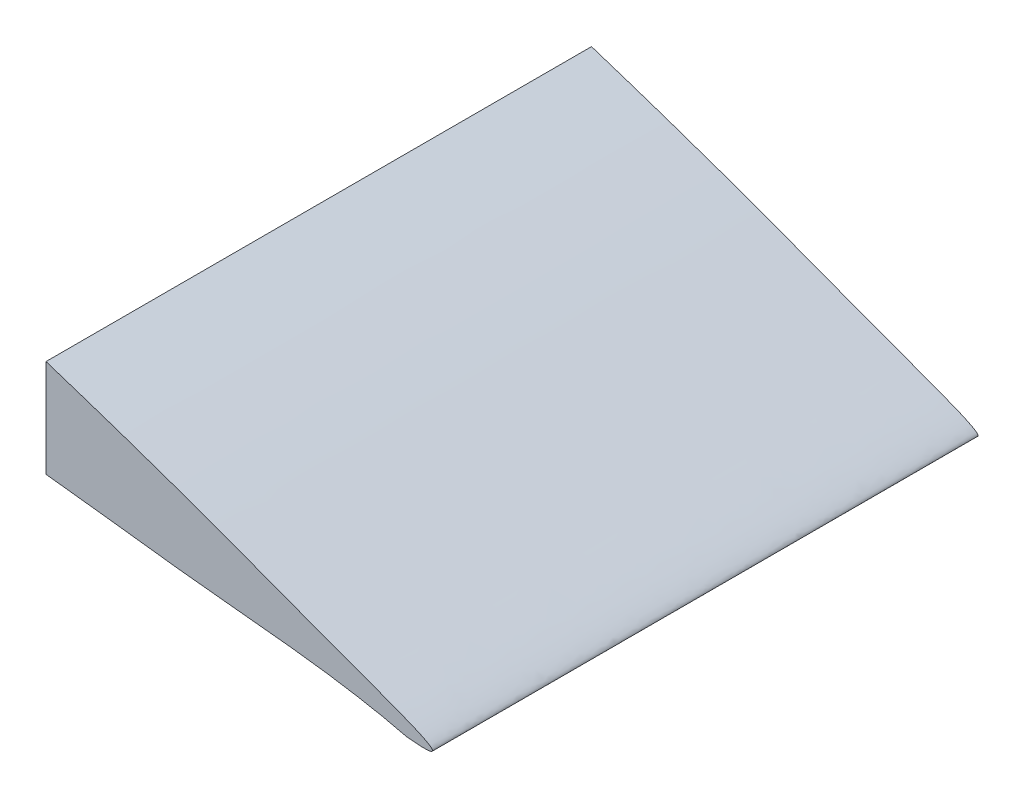
ISO-10303-21;
HEADER;
FILE_DESCRIPTION(('STEP AP214'),'2;1');
FILE_NAME('part.step','',(''),(''),'','','');
FILE_SCHEMA(('AUTOMOTIVE_DESIGN { 1 0 10303 214 1 1 1 1 }'));
ENDSEC;
DATA;
#1=APPLICATION_CONTEXT('core data for automotive mechanical design processes');
#2=APPLICATION_PROTOCOL_DEFINITION('international standard','automotive_design',2000,#1);
#3=PRODUCT_CONTEXT('',#1,'mechanical');
#4=PRODUCT('Part','Part','',(#3));
#5=PRODUCT_RELATED_PRODUCT_CATEGORY('part','',(#4));
#6=PRODUCT_DEFINITION_FORMATION('','',#4);
#7=PRODUCT_DEFINITION_CONTEXT('part definition',#1,'design');
#8=PRODUCT_DEFINITION('design','',#6,#7);
#9=PRODUCT_DEFINITION_SHAPE('','',#8);
#10=(LENGTH_UNIT() NAMED_UNIT(*) SI_UNIT(.MILLI.,.METRE.));
#11=(NAMED_UNIT(*) PLANE_ANGLE_UNIT() SI_UNIT($,.RADIAN.));
#12=(NAMED_UNIT(*) SI_UNIT($,.STERADIAN.) SOLID_ANGLE_UNIT());
#13=UNCERTAINTY_MEASURE_WITH_UNIT(LENGTH_MEASURE(1.E-05),#10,'distance_accuracy_value','');
#14=(GEOMETRIC_REPRESENTATION_CONTEXT(3) GLOBAL_UNCERTAINTY_ASSIGNED_CONTEXT((#13)) GLOBAL_UNIT_ASSIGNED_CONTEXT((#10,
#11,#12)) REPRESENTATION_CONTEXT('',''));
#15=CARTESIAN_POINT('',(0.,0.,0.));
#16=DIRECTION('',(0.,0.,1.));
#17=DIRECTION('',(1.,0.,0.));
#18=AXIS2_PLACEMENT_3D('',#15,#16,#17);
#19=CARTESIAN_POINT('',(0.000560351162113587,0.000130087070423624,46.0375));
#20=CARTESIAN_POINT('',(1.23071418869678,-6.92407609127206,46.0375));
#21=CARTESIAN_POINT('',(15.3166033306834,-6.18906584099094,46.0375));
#22=CARTESIAN_POINT('',(36.4546728163185,-6.09849990105009,46.0375));
#23=CARTESIAN_POINT('',(66.5061971849192,-0.586669106973501,46.0375));
#24=CARTESIAN_POINT('',(110.497331171581,6.18149522271792,46.0375));
#25=CARTESIAN_POINT('',(157.718638091679,9.03065014873911,46.0375));
#26=CARTESIAN_POINT('',(205.10142463584,8.83808028186313,46.0375));
#27=CARTESIAN_POINT('',(235.858814759408,7.87030619247826,46.0375));
#28=CARTESIAN_POINT('',(260.846344817159,5.42741339404395,46.0375));
#29=CARTESIAN_POINT('',(276.264022989737,4.51435670375389,46.0375));
#30=CARTESIAN_POINT('',(293.989507544058,2.09398731346533,46.0375));
#31=CARTESIAN_POINT('',(303.956832564589,1.47095520994628,46.0375));
#32=CARTESIAN_POINT('',(309.846313894505,0.000130087070423666,46.0375));
#33=B_SPLINE_CURVE_WITH_KNOTS('',3,(#19,#20,#21,#22,#23,#24,#25,#26,#27,#28,#29,#30,#31,#32),
.UNSPECIFIED.,.F.,.F.,(4,1,1,1,1,1,1,1,1,1,1,4),(0.,0.0569078595717698,0.106482711504673,
0.214488052979465,0.341297688349143,0.535095665520157,0.664680853556909,0.794660698192775,
0.828978881532905,0.904725108725214,0.942212919019968,1.),.UNSPECIFIED.);
#34=DIRECTION('',(0.,0.,-1.));
#35=VECTOR('',#34,1.);
#36=SURFACE_OF_LINEAR_EXTRUSION('',#33,#35);
#37=CARTESIAN_POINT('',(279.400560351162,3.963287461144,46.0375));
#38=VERTEX_POINT('',#37);
#39=CARTESIAN_POINT('',(309.846313894505,0.000130087070423864,46.0375));
#40=VERTEX_POINT('',#39);
#41=EDGE_CURVE('E66',#38,#40,#33,.T.);
#42=ORIENTED_EDGE('',*,*,#41,.F.);
#43=DIRECTION('',(0.,0.,-1.));
#44=VECTOR('',#43,1.);
#45=CARTESIAN_POINT('',(279.400560351162,3.96328746010702,46.0375));
#46=LINE('',#45,#44);
#47=CARTESIAN_POINT('',(279.400560351162,3.963287461144,0.));
#48=VERTEX_POINT('',#47);
#49=EDGE_CURVE('E77',#38,#48,#46,.T.);
#50=ORIENTED_EDGE('',*,*,#49,.T.);
#51=CARTESIAN_POINT('',(0.000560351162113587,0.000130087070423624,0.));
#52=CARTESIAN_POINT('',(1.23071418869678,-6.92407609127206,0.));
#53=CARTESIAN_POINT('',(15.3166033306834,-6.18906584099094,0.));
#54=CARTESIAN_POINT('',(36.4546728163185,-6.09849990105009,0.));
#55=CARTESIAN_POINT('',(66.5061971849192,-0.586669106973501,0.));
#56=CARTESIAN_POINT('',(110.497331171581,6.18149522271792,0.));
#57=CARTESIAN_POINT('',(157.718638091679,9.03065014873911,0.));
#58=CARTESIAN_POINT('',(205.10142463584,8.83808028186313,0.));
#59=CARTESIAN_POINT('',(235.858814759408,7.87030619247826,0.));
#60=CARTESIAN_POINT('',(260.846344817159,5.42741339404395,0.));
#61=CARTESIAN_POINT('',(276.264022989737,4.51435670375389,0.));
#62=CARTESIAN_POINT('',(293.989507544058,2.09398731346533,0.));
#63=CARTESIAN_POINT('',(303.956832564589,1.47095520994628,0.));
#64=CARTESIAN_POINT('',(309.846313894505,0.000130087070423666,0.));
#65=B_SPLINE_CURVE_WITH_KNOTS('',3,(#51,#52,#53,#54,#55,#56,#57,#58,#59,#60,#61,#62,#63,#64),
.UNSPECIFIED.,.F.,.F.,(4,1,1,1,1,1,1,1,1,1,1,4),(0.,0.0569078595717698,0.106482711504673,
0.214488052979465,0.341297688349143,0.535095665520157,0.664680853556909,0.794660698192775,
0.828978881532905,0.904725108725214,0.942212919019968,1.),.UNSPECIFIED.);
#66=CARTESIAN_POINT('',(309.846313894505,0.000130087070423864,0.));
#67=VERTEX_POINT('',#66);
#68=EDGE_CURVE('E84',#48,#67,#65,.T.);
#69=ORIENTED_EDGE('',*,*,#68,.T.);
#70=DIRECTION('',(0.,0.,-1.));
#71=VECTOR('',#70,1.);
#72=CARTESIAN_POINT('',(309.846313894505,0.000130087070423864,46.0375));
#73=LINE('',#72,#71);
#74=EDGE_CURVE('E11',#40,#67,#73,.T.);
#75=ORIENTED_EDGE('',*,*,#74,.F.);
#76=EDGE_LOOP('',(#42,#50,#69,#75));
#77=FACE_BOUND('',#76,.T.);
#78=ADVANCED_FACE('F38',(#77),#36,.F.);
#79=CARTESIAN_POINT('',(309.846313894505,0.000130087070423864,46.0375));
#80=CARTESIAN_POINT('',(314.816918223261,-0.51620674157964,46.0375));
#81=CARTESIAN_POINT('',(301.273197720551,4.38282813873556,46.0375));
#82=CARTESIAN_POINT('',(290.359837670022,8.71099439045776,46.0375));
#83=CARTESIAN_POINT('',(256.952064400645,19.5289209482833,46.0375));
#84=CARTESIAN_POINT('',(217.961060472083,29.6129748944238,46.0375));
#85=CARTESIAN_POINT('',(173.256699242147,40.0411042779434,46.0375));
#86=CARTESIAN_POINT('',(131.400792108858,47.8848319151037,46.0375));
#87=CARTESIAN_POINT('',(89.5976184754884,49.290763053775,46.0375));
#88=CARTESIAN_POINT('',(52.1111282710831,42.0692152748914,46.0375));
#89=CARTESIAN_POINT('',(26.2867198183782,29.9751763284633,46.0375));
#90=CARTESIAN_POINT('',(8.64909202481883,17.8566051741579,46.0375));
#91=CARTESIAN_POINT('',(0.810633126632263,7.35919605469637,46.0375));
#92=CARTESIAN_POINT('',(0.000560351162116727,0.000130087070423829,46.0375));
#93=B_SPLINE_CURVE_WITH_KNOTS('',3,(#79,#80,#81,#82,#83,#84,#85,#86,#87,#88,#89,#90,#91,#92),
.UNSPECIFIED.,.F.,.F.,(4,1,1,1,1,1,1,1,1,1,1,4),(0.,0.0239417713693992,0.070244030177139,
0.147561721425381,0.308455887006792,0.442387865106874,0.551517565626309,0.687091076796298,
0.811391258419108,0.886311735305172,0.939136382225768,1.),.UNSPECIFIED.);
#94=DIRECTION('',(0.,0.,-1.));
#95=VECTOR('',#94,1.);
#96=SURFACE_OF_LINEAR_EXTRUSION('',#93,#95);
#97=CARTESIAN_POINT('',(309.846313894505,0.000130087070423864,0.));
#98=CARTESIAN_POINT('',(314.816918223261,-0.51620674157964,0.));
#99=CARTESIAN_POINT('',(301.273197720551,4.38282813873556,0.));
#100=CARTESIAN_POINT('',(290.359837670022,8.71099439045776,0.));
#101=CARTESIAN_POINT('',(256.952064400645,19.5289209482833,0.));
#102=CARTESIAN_POINT('',(217.961060472083,29.6129748944238,0.));
#103=CARTESIAN_POINT('',(173.256699242147,40.0411042779434,0.));
#104=CARTESIAN_POINT('',(131.400792108858,47.8848319151037,0.));
#105=CARTESIAN_POINT('',(89.5976184754884,49.290763053775,0.));
#106=CARTESIAN_POINT('',(52.1111282710831,42.0692152748914,0.));
#107=CARTESIAN_POINT('',(26.2867198183782,29.9751763284633,0.));
#108=CARTESIAN_POINT('',(8.64909202481883,17.8566051741579,0.));
#109=CARTESIAN_POINT('',(0.810633126632263,7.35919605469637,0.));
#110=CARTESIAN_POINT('',(0.000560351162116727,0.000130087070423829,0.));
#111=B_SPLINE_CURVE_WITH_KNOTS('',3,(#97,#98,#99,#100,#101,#102,#103,#104,#105,#106,#107,#108,
#109,#110),.UNSPECIFIED.,.F.,.F.,(4,1,1,1,1,1,1,1,1,1,1,4),(0.,0.0239417713693992,
0.070244030177139,0.147561721425381,0.308455887006792,0.442387865106874,0.551517565626309,
0.687091076796298,0.811391258419108,0.886311735305172,0.939136382225768,1.),.UNSPECIFIED.);
#112=CARTESIAN_POINT('',(279.40056035979,12.2072210123206,0.));
#113=VERTEX_POINT('',#112);
#114=EDGE_CURVE('E90',#67,#113,#111,.T.);
#115=ORIENTED_EDGE('',*,*,#114,.T.);
#116=DIRECTION('',(0.,0.,-1.));
#117=VECTOR('',#116,1.);
#118=CARTESIAN_POINT('',(279.400560351162,12.207221015124,46.0375));
#119=LINE('',#118,#117);
#120=CARTESIAN_POINT('',(279.400560351162,12.2072210123206,46.0375));
#121=VERTEX_POINT('',#120);
#122=EDGE_CURVE('E56',#113,#121,#119,.F.);
#123=ORIENTED_EDGE('',*,*,#122,.T.);
#124=EDGE_CURVE('E47',#40,#121,#93,.T.);
#125=ORIENTED_EDGE('',*,*,#124,.F.);
#126=ORIENTED_EDGE('',*,*,#74,.T.);
#127=EDGE_LOOP('',(#115,#123,#125,#126));
#128=FACE_BOUND('',#127,.T.);
#129=ADVANCED_FACE('F111',(#128),#96,.F.);
#130=CARTESIAN_POINT('',(153.387816973495,8.33338198857885,46.0375));
#131=DIRECTION('',(0.,0.,-1.));
#132=DIRECTION('',(-1.,0.,0.));
#133=AXIS2_PLACEMENT_3D('',#130,#131,#132);
#134=PLANE('',#133);
#135=ORIENTED_EDGE('',*,*,#124,.T.);
#136=DIRECTION('',(0.,1.,0.));
#137=VECTOR('',#136,1.);
#138=CARTESIAN_POINT('',(279.400560351162,-24.2165503945353,46.0375));
#139=LINE('',#138,#137);
#140=EDGE_CURVE('E79',#38,#121,#139,.T.);
#141=ORIENTED_EDGE('',*,*,#140,.F.);
#142=ORIENTED_EDGE('',*,*,#41,.T.);
#143=EDGE_LOOP('',(#135,#141,#142));
#144=FACE_BOUND('',#143,.T.);
#145=ADVANCED_FACE('F86',(#144),#134,.F.);
#146=CARTESIAN_POINT('',(153.387816973495,8.33338198857885,0.));
#147=DIRECTION('',(0.,0.,-1.));
#148=DIRECTION('',(-1.,0.,0.));
#149=AXIS2_PLACEMENT_3D('',#146,#147,#148);
#150=PLANE('',#149);
#151=DIRECTION('',(0.,1.,0.));
#152=VECTOR('',#151,1.);
#153=CARTESIAN_POINT('',(279.400560351162,-24.2165503945353,0.));
#154=LINE('',#153,#152);
#155=EDGE_CURVE('E80',#48,#113,#154,.T.);
#156=ORIENTED_EDGE('',*,*,#155,.T.);
#157=ORIENTED_EDGE('',*,*,#114,.F.);
#158=ORIENTED_EDGE('',*,*,#68,.F.);
#159=EDGE_LOOP('',(#156,#157,#158));
#160=FACE_BOUND('',#159,.T.);
#161=ADVANCED_FACE('F115',(#160),#150,.T.);
#162=CARTESIAN_POINT('',(279.400560351162,-24.2165503945353,0.));
#163=DIRECTION('',(1.,0.,0.));
#164=DIRECTION('',(0.,0.,-1.));
#165=AXIS2_PLACEMENT_3D('',#162,#163,#164);
#166=PLANE('',#165);
#167=ORIENTED_EDGE('',*,*,#140,.T.);
#168=ORIENTED_EDGE('',*,*,#122,.F.);
#169=ORIENTED_EDGE('',*,*,#155,.F.);
#170=ORIENTED_EDGE('',*,*,#49,.F.);
#171=EDGE_LOOP('',(#167,#168,#169,#170));
#172=FACE_BOUND('',#171,.T.);
#173=ADVANCED_FACE('F78',(#172),#166,.F.);
#174=CLOSED_SHELL('',(#78,#129,#145,#161,#173));
#175=MANIFOLD_SOLID_BREP('B2',#174);
#176=ADVANCED_BREP_SHAPE_REPRESENTATION('',(#18,#175),#14);
#177=SHAPE_DEFINITION_REPRESENTATION(#9,#176);
ENDSEC;
END-ISO-10303-21;
